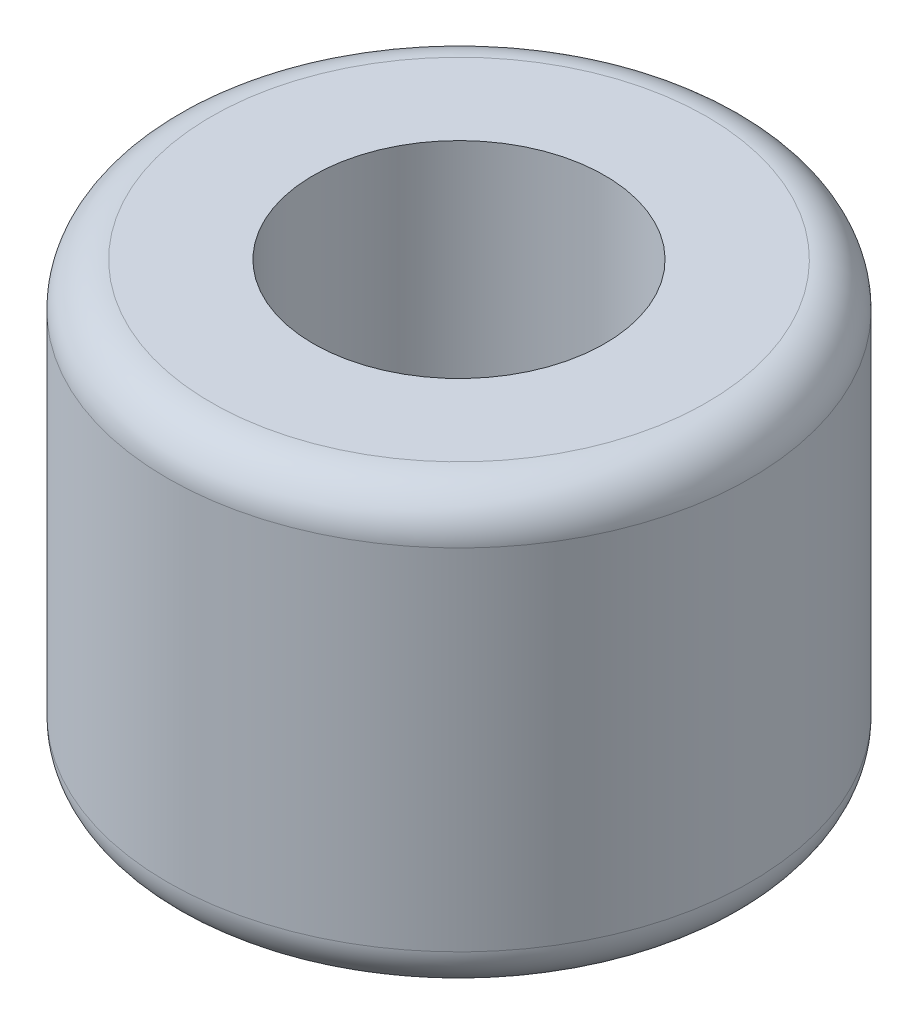
ISO-10303-21;
HEADER;
FILE_DESCRIPTION(('STEP AP214'),'2;1');
FILE_NAME('part.step','',(''),(''),'','','');
FILE_SCHEMA(('AUTOMOTIVE_DESIGN { 1 0 10303 214 1 1 1 1 }'));
ENDSEC;
DATA;
#1=APPLICATION_CONTEXT('core data for automotive mechanical design processes');
#2=APPLICATION_PROTOCOL_DEFINITION('international standard','automotive_design',2000,#1);
#3=PRODUCT_CONTEXT('',#1,'mechanical');
#4=PRODUCT('Part','Part','',(#3));
#5=PRODUCT_RELATED_PRODUCT_CATEGORY('part','',(#4));
#6=PRODUCT_DEFINITION_FORMATION('','',#4);
#7=PRODUCT_DEFINITION_CONTEXT('part definition',#1,'design');
#8=PRODUCT_DEFINITION('design','',#6,#7);
#9=PRODUCT_DEFINITION_SHAPE('','',#8);
#10=(LENGTH_UNIT() NAMED_UNIT(*) SI_UNIT(.MILLI.,.METRE.));
#11=(NAMED_UNIT(*) PLANE_ANGLE_UNIT() SI_UNIT($,.RADIAN.));
#12=(NAMED_UNIT(*) SI_UNIT($,.STERADIAN.) SOLID_ANGLE_UNIT());
#13=UNCERTAINTY_MEASURE_WITH_UNIT(LENGTH_MEASURE(1.E-05),#10,'distance_accuracy_value','');
#14=(GEOMETRIC_REPRESENTATION_CONTEXT(3) GLOBAL_UNCERTAINTY_ASSIGNED_CONTEXT((#13)) GLOBAL_UNIT_ASSIGNED_CONTEXT((#10,
#11,#12)) REPRESENTATION_CONTEXT('',''));
#15=CARTESIAN_POINT('',(0.,0.,0.));
#16=DIRECTION('',(0.,0.,1.));
#17=DIRECTION('',(1.,0.,0.));
#18=AXIS2_PLACEMENT_3D('',#15,#16,#17);
#19=CARTESIAN_POINT('',(101.6,0.,0.));
#20=DIRECTION('',(0.,1.,0.));
#21=DIRECTION('',(0.,0.,1.));
#22=AXIS2_PLACEMENT_3D('',#19,#20,#21);
#23=PLANE('',#22);
#24=CARTESIAN_POINT('',(76.2,0.,0.));
#25=DIRECTION('',(0.,1.,0.));
#26=DIRECTION('',(0.,0.,1.));
#27=AXIS2_PLACEMENT_3D('',#24,#25,#26);
#28=CIRCLE('',#27,12.7);
#29=CARTESIAN_POINT('',(85.979,0.,-8.10315734760227));
#30=VERTEX_POINT('',#29);
#31=CARTESIAN_POINT('',(85.979,0.,8.10315734760227));
#32=VERTEX_POINT('',#31);
#33=EDGE_CURVE('E64',#30,#32,#28,.T.);
#34=ORIENTED_EDGE('',*,*,#33,.T.);
#35=CARTESIAN_POINT('',(0.,0.,0.));
#36=DIRECTION('',(0.,1.,0.));
#37=DIRECTION('',(0.,0.,1.));
#38=AXIS2_PLACEMENT_3D('',#35,#36,#37);
#39=CIRCLE('',#38,86.36);
#40=CARTESIAN_POINT('',(-85.979,0.,8.10315734760227));
#41=VERTEX_POINT('',#40);
#42=EDGE_CURVE('E66',#32,#41,#39,.F.);
#43=ORIENTED_EDGE('',*,*,#42,.T.);
#44=CARTESIAN_POINT('',(-76.2,0.,0.));
#45=DIRECTION('',(0.,1.,0.));
#46=DIRECTION('',(0.,0.,1.));
#47=AXIS2_PLACEMENT_3D('',#44,#45,#46);
#48=CIRCLE('',#47,12.7);
#49=CARTESIAN_POINT('',(-85.979,0.,-8.10315734760227));
#50=VERTEX_POINT('',#49);
#51=EDGE_CURVE('E199',#41,#50,#48,.T.);
#52=ORIENTED_EDGE('',*,*,#51,.T.);
#53=CARTESIAN_POINT('',(0.,0.,0.));
#54=DIRECTION('',(0.,1.,0.));
#55=DIRECTION('',(0.,0.,1.));
#56=AXIS2_PLACEMENT_3D('',#53,#54,#55);
#57=CIRCLE('',#56,86.36);
#58=EDGE_CURVE('E67',#50,#30,#57,.F.);
#59=ORIENTED_EDGE('',*,*,#58,.T.);
#60=EDGE_LOOP('',(#34,#43,#52,#59));
#61=FACE_BOUND('',#60,.T.);
#62=ADVANCED_FACE('F33',(#61),#23,.F.);
#63=CARTESIAN_POINT('',(0.,25.4,0.));
#64=DIRECTION('',(0.,-1.,0.));
#65=DIRECTION('',(0.,0.,-1.));
#66=AXIS2_PLACEMENT_3D('',#63,#64,#65);
#67=PLANE('',#66);
#68=CARTESIAN_POINT('',(0.,25.4,0.));
#69=DIRECTION('',(0.,1.,0.));
#70=DIRECTION('',(0.,0.,1.));
#71=AXIS2_PLACEMENT_3D('',#68,#69,#70);
#72=CIRCLE('',#71,50.8);
#73=CARTESIAN_POINT('',(0.,25.4,50.8));
#74=VERTEX_POINT('',#73);
#75=EDGE_CURVE('E198',#74,#74,#72,.T.);
#76=ORIENTED_EDGE('',*,*,#75,.T.);
#77=EDGE_LOOP('',(#76));
#78=FACE_BOUND('',#77,.T.);
#79=ADVANCED_FACE('F106',(#78),#67,.F.);
#80=CARTESIAN_POINT('',(0.,0.,0.));
#81=DIRECTION('',(0.,1.,0.));
#82=DIRECTION('',(0.,0.,1.));
#83=AXIS2_PLACEMENT_3D('',#80,#81,#82);
#84=CYLINDRICAL_SURFACE('',#83,50.8);
#85=ORIENTED_EDGE('',*,*,#75,.F.);
#86=EDGE_LOOP('',(#85));
#87=FACE_BOUND('',#86,.T.);
#88=CARTESIAN_POINT('',(0.,152.4,0.));
#89=DIRECTION('',(0.,1.,0.));
#90=DIRECTION('',(0.,0.,1.));
#91=AXIS2_PLACEMENT_3D('',#88,#89,#90);
#92=CIRCLE('',#91,50.8);
#93=CARTESIAN_POINT('',(0.,152.4,50.8));
#94=VERTEX_POINT('',#93);
#95=EDGE_CURVE('E196',#94,#94,#92,.T.);
#96=ORIENTED_EDGE('',*,*,#95,.T.);
#97=EDGE_LOOP('',(#96));
#98=FACE_BOUND('',#97,.T.);
#99=ADVANCED_FACE('F102',(#87,#98),#84,.F.);
#100=CARTESIAN_POINT('',(50.8,152.4,0.));
#101=DIRECTION('',(0.,-1.,0.));
#102=DIRECTION('',(0.,0.,-1.));
#103=AXIS2_PLACEMENT_3D('',#100,#101,#102);
#104=PLANE('',#103);
#105=CARTESIAN_POINT('',(0.,152.4,0.));
#106=DIRECTION('',(0.,-1.,0.));
#107=DIRECTION('',(0.,0.,-1.));
#108=AXIS2_PLACEMENT_3D('',#105,#106,#107);
#109=CIRCLE('',#108,86.36);
#110=CARTESIAN_POINT('',(0.,152.4,-86.36));
#111=VERTEX_POINT('',#110);
#112=EDGE_CURVE('E11',#111,#111,#109,.F.);
#113=ORIENTED_EDGE('',*,*,#112,.T.);
#114=EDGE_LOOP('',(#113));
#115=FACE_BOUND('',#114,.T.);
#116=ORIENTED_EDGE('',*,*,#95,.F.);
#117=EDGE_LOOP('',(#116));
#118=FACE_BOUND('',#117,.T.);
#119=ADVANCED_FACE('F98',(#115,#118),#104,.F.);
#120=CARTESIAN_POINT('',(0.,0.,0.));
#121=DIRECTION('',(0.,1.,0.));
#122=DIRECTION('',(0.,0.,1.));
#123=AXIS2_PLACEMENT_3D('',#120,#121,#122);
#124=CYLINDRICAL_SURFACE('',#123,101.6);
#125=CARTESIAN_POINT('',(0.,15.24,0.));
#126=DIRECTION('',(0.,1.,0.));
#127=DIRECTION('',(0.,0.,1.));
#128=AXIS2_PLACEMENT_3D('',#125,#126,#127);
#129=CIRCLE('',#128,101.6);
#130=CARTESIAN_POINT('',(0.,15.24,101.6));
#131=VERTEX_POINT('',#130);
#132=EDGE_CURVE('E75',#131,#131,#129,.T.);
#133=ORIENTED_EDGE('',*,*,#132,.T.);
#134=EDGE_LOOP('',(#133));
#135=FACE_BOUND('',#134,.T.);
#136=CARTESIAN_POINT('',(0.,137.16,0.));
#137=DIRECTION('',(0.,-1.,0.));
#138=DIRECTION('',(0.,0.,-1.));
#139=AXIS2_PLACEMENT_3D('',#136,#137,#138);
#140=CIRCLE('',#139,101.6);
#141=CARTESIAN_POINT('',(0.,137.16,-101.6));
#142=VERTEX_POINT('',#141);
#143=EDGE_CURVE('E191',#142,#142,#140,.T.);
#144=ORIENTED_EDGE('',*,*,#143,.T.);
#145=EDGE_LOOP('',(#144));
#146=FACE_BOUND('',#145,.T.);
#147=ADVANCED_FACE('F94',(#135,#146),#124,.T.);
#148=CARTESIAN_POINT('',(-76.2,63.5,0.));
#149=DIRECTION('',(0.,-1.,0.));
#150=DIRECTION('',(0.,0.,-1.));
#151=AXIS2_PLACEMENT_3D('',#148,#149,#150);
#152=CYLINDRICAL_SURFACE('',#151,12.7);
#153=CARTESIAN_POINT('',(-76.2,63.5,0.));
#154=DIRECTION('',(0.,-1.,0.));
#155=DIRECTION('',(0.,0.,-1.));
#156=AXIS2_PLACEMENT_3D('',#153,#154,#155);
#157=CIRCLE('',#156,12.7);
#158=CARTESIAN_POINT('',(-76.2,63.5,-12.7));
#159=VERTEX_POINT('',#158);
#160=EDGE_CURVE('E68',#159,#159,#157,.T.);
#161=ORIENTED_EDGE('',*,*,#160,.F.);
#162=EDGE_LOOP('',(#161));
#163=FACE_BOUND('',#162,.T.);
#164=ORIENTED_EDGE('',*,*,#51,.F.);
#165=CARTESIAN_POINT('',(-85.979,0.,8.10315734760227));
#166=CARTESIAN_POINT('',(-86.2064080344139,3.53228284826473E-05,7.82877923337576));
#167=CARTESIAN_POINT('',(-86.4221760645276,0.00396392415393852,7.54482039768916));
#168=CARTESIAN_POINT('',(-86.8290196342907,0.017261896777991,6.95992496499968));
#169=CARTESIAN_POINT('',(-87.0200998757241,0.0266302302080088,6.65899161651892));
#170=CARTESIAN_POINT('',(-87.3761905622153,0.0484604563267252,6.04231567580565));
#171=CARTESIAN_POINT('',(-87.5412086940009,0.0609214340759018,5.72657748585997));
#172=CARTESIAN_POINT('',(-87.8441404093158,0.0868888554278346,5.0823876171319));
#173=CARTESIAN_POINT('',(-87.9820532514321,0.100395327613994,4.75393559088109));
#174=CARTESIAN_POINT('',(-88.2298404777689,0.126667517713358,4.08652350550148));
#175=CARTESIAN_POINT('',(-88.339709847833,0.139433102841579,3.74756157934229));
#176=CARTESIAN_POINT('',(-88.5306028900728,0.162750519575065,3.06153487386942));
#177=CARTESIAN_POINT('',(-88.6116267391348,0.173302364755254,2.71447014425764));
#178=CARTESIAN_POINT('',(-88.744200077716,0.191070374419406,2.0148752576846));
#179=CARTESIAN_POINT('',(-88.7957664281737,0.198288446640598,1.66234834611178));
#180=CARTESIAN_POINT('',(-88.8691090604624,0.208672103764167,0.954150563454994));
#181=CARTESIAN_POINT('',(-88.8908856040092,0.211837724268993,0.598479720019391));
#182=CARTESIAN_POINT('',(-88.9044683597616,0.213804107029748,-0.112683842908259));
#183=CARTESIAN_POINT('',(-88.8963386280013,0.21261419838903,-0.468175313889037));
#184=CARTESIAN_POINT('',(-88.8503134924184,0.206006057718569,-1.17718977825992));
#185=CARTESIAN_POINT('',(-88.8124177129835,0.200587772331712,-1.53071274675315));
#186=CARTESIAN_POINT('',(-88.7070975590068,0.186050881982603,-2.2335870039051));
#187=CARTESIAN_POINT('',(-88.6396459077609,0.17692885946479,-2.58293413206673));
#188=CARTESIAN_POINT('',(-88.4757087234525,0.155921459272625,-3.27464603840244));
#189=CARTESIAN_POINT('',(-88.3792243248697,0.144036189578664,-3.61701108884915));
#190=CARTESIAN_POINT('',(-88.1580346946474,0.118821657070781,-4.29201711748457));
#191=CARTESIAN_POINT('',(-88.0333611050163,0.105494021972268,-4.62466852996775));
#192=CARTESIAN_POINT('',(-87.7565643401677,0.0790121268801335,-5.27843137202579));
#193=CARTESIAN_POINT('',(-87.6044362998543,0.0658578980591954,-5.59954074416732));
#194=CARTESIAN_POINT('',(-87.2741740422258,0.0416759807061349,-6.22721187991893));
#195=CARTESIAN_POINT('',(-87.0961006772233,0.0306434526668085,-6.53380551853572));
#196=CARTESIAN_POINT('',(-86.7149611257509,0.0128322885911748,-7.13098253758662));
#197=CARTESIAN_POINT('',(-86.5119120256532,0.00605076351266157,-7.42157666873459));
#198=CARTESIAN_POINT('',(-86.2454449931648,0.00174102482737826,-7.77086299786997));
#199=CARTESIAN_POINT('',(-86.1930711629024,0.00109657364145301,-7.83809918036604));
#200=CARTESIAN_POINT('',(-86.0870188945477,0.000226213699578402,-7.97145550412643));
#201=CARTESIAN_POINT('',(-86.0333414590502,-6.99387940293603E-09,-8.03757644069396));
#202=CARTESIAN_POINT('',(-85.979,0.,-8.10315734760228));
#203=B_SPLINE_CURVE_WITH_KNOTS('',3,(#165,#166,#167,#168,#169,#170,#171,#172,#173,#174,#175,
#176,#177,#178,#179,#180,#181,#182,#183,#184,#185,#186,#187,#188,#189,#190,#191,#192,#193,#194,
#195,#196,#197,#198,#199,#200,#201,#202),.UNSPECIFIED.,.F.,.F.,(4,2,2,2,2,2,2,2,2,2,2,2,2,2,2,2,
2,2,4),(0.,1.06869477671921,2.13718571978978,3.20536093250404,4.27356535902594,5.34196064629181,
6.41034938183538,7.47812597670891,8.54589319066311,9.61137469471175,10.6768696440943,
11.7433500019055,12.8097886914879,13.8750362082325,14.9404726790128,16.0034493369325,
17.0657027953037,17.3213819626156,17.5768703543866),.UNSPECIFIED.);
#204=EDGE_CURVE('E48',#41,#50,#203,.T.);
#205=ORIENTED_EDGE('',*,*,#204,.T.);
#206=EDGE_LOOP('',(#164,#205));
#207=FACE_BOUND('',#206,.T.);
#208=ADVANCED_FACE('F88',(#163,#207),#152,.F.);
#209=CARTESIAN_POINT('',(-76.2,63.5,0.));
#210=DIRECTION('',(0.,-1.,0.));
#211=DIRECTION('',(0.,0.,-1.));
#212=AXIS2_PLACEMENT_3D('',#209,#210,#211);
#213=PLANE('',#212);
#214=ORIENTED_EDGE('',*,*,#160,.T.);
#215=EDGE_LOOP('',(#214));
#216=FACE_BOUND('',#215,.T.);
#217=ADVANCED_FACE('F93',(#216),#213,.T.);
#218=CARTESIAN_POINT('',(76.2,63.5,0.));
#219=DIRECTION('',(0.,-1.,0.));
#220=DIRECTION('',(0.,0.,-1.));
#221=AXIS2_PLACEMENT_3D('',#218,#219,#220);
#222=CYLINDRICAL_SURFACE('',#221,12.7);
#223=CARTESIAN_POINT('',(76.2,63.5,0.));
#224=DIRECTION('',(0.,-1.,0.));
#225=DIRECTION('',(0.,0.,1.));
#226=AXIS2_PLACEMENT_3D('',#223,#224,#225);
#227=CIRCLE('',#226,12.7);
#228=CARTESIAN_POINT('',(76.2,63.5,12.7));
#229=VERTEX_POINT('',#228);
#230=EDGE_CURVE('E69',#229,#229,#227,.T.);
#231=ORIENTED_EDGE('',*,*,#230,.F.);
#232=EDGE_LOOP('',(#231));
#233=FACE_BOUND('',#232,.T.);
#234=ORIENTED_EDGE('',*,*,#33,.F.);
#235=CARTESIAN_POINT('',(85.979,0.,-8.10315734760227));
#236=CARTESIAN_POINT('',(86.2064080344139,3.53228284826473E-05,-7.82877923337576));
#237=CARTESIAN_POINT('',(86.4221760645276,0.00396392415393852,-7.54482039768916));
#238=CARTESIAN_POINT('',(86.8290196342907,0.017261896777991,-6.95992496499968));
#239=CARTESIAN_POINT('',(87.0200998757241,0.0266302302080088,-6.65899161651892));
#240=CARTESIAN_POINT('',(87.3761905622153,0.0484604563267252,-6.04231567580565));
#241=CARTESIAN_POINT('',(87.5412086940009,0.0609214340759018,-5.72657748585997));
#242=CARTESIAN_POINT('',(87.8441404093158,0.0868888554278346,-5.0823876171319));
#243=CARTESIAN_POINT('',(87.9820532514321,0.100395327613994,-4.75393559088109));
#244=CARTESIAN_POINT('',(88.2298404777689,0.126667517713358,-4.08652350550148));
#245=CARTESIAN_POINT('',(88.339709847833,0.139433102841579,-3.74756157934229));
#246=CARTESIAN_POINT('',(88.5306028900728,0.162750519575065,-3.06153487386942));
#247=CARTESIAN_POINT('',(88.6116267391348,0.173302364755254,-2.71447014425764));
#248=CARTESIAN_POINT('',(88.744200077716,0.191070374419406,-2.0148752576846));
#249=CARTESIAN_POINT('',(88.7957664281737,0.198288446640598,-1.66234834611178));
#250=CARTESIAN_POINT('',(88.8691090604624,0.208672103764167,-0.954150563454994));
#251=CARTESIAN_POINT('',(88.8908856040092,0.211837724268993,-0.598479720019391));
#252=CARTESIAN_POINT('',(88.9044683597616,0.213804107029748,0.112683842908259));
#253=CARTESIAN_POINT('',(88.8963386280013,0.21261419838903,0.468175313889037));
#254=CARTESIAN_POINT('',(88.8503134924184,0.206006057718569,1.17718977825992));
#255=CARTESIAN_POINT('',(88.8124177129835,0.200587772331712,1.53071274675315));
#256=CARTESIAN_POINT('',(88.7070975590068,0.186050881982603,2.2335870039051));
#257=CARTESIAN_POINT('',(88.6396459077609,0.17692885946479,2.58293413206673));
#258=CARTESIAN_POINT('',(88.4757087234525,0.155921459272625,3.27464603840244));
#259=CARTESIAN_POINT('',(88.3792243248697,0.144036189578664,3.61701108884915));
#260=CARTESIAN_POINT('',(88.1580346946474,0.118821657070781,4.29201711748457));
#261=CARTESIAN_POINT('',(88.0333611050163,0.105494021972268,4.62466852996775));
#262=CARTESIAN_POINT('',(87.7565643401677,0.0790121268801335,5.27843137202579));
#263=CARTESIAN_POINT('',(87.6044362998543,0.0658578980591954,5.59954074416732));
#264=CARTESIAN_POINT('',(87.2741740422258,0.0416759807061349,6.22721187991893));
#265=CARTESIAN_POINT('',(87.0961006772233,0.0306434526668085,6.53380551853572));
#266=CARTESIAN_POINT('',(86.7149611257509,0.0128322885911748,7.13098253758662));
#267=CARTESIAN_POINT('',(86.5119120256532,0.00605076351266157,7.42157666873459));
#268=CARTESIAN_POINT('',(86.2454449931648,0.00174102482737826,7.77086299786997));
#269=CARTESIAN_POINT('',(86.1930711629024,0.00109657364145301,7.83809918036604));
#270=CARTESIAN_POINT('',(86.0870188945477,0.000226213699578402,7.97145550412643));
#271=CARTESIAN_POINT('',(86.0333414590502,-6.99387940293603E-09,8.03757644069396));
#272=CARTESIAN_POINT('',(85.979,0.,8.10315734760228));
#273=B_SPLINE_CURVE_WITH_KNOTS('',3,(#235,#236,#237,#238,#239,#240,#241,#242,#243,#244,#245,
#246,#247,#248,#249,#250,#251,#252,#253,#254,#255,#256,#257,#258,#259,#260,#261,#262,#263,#264,
#265,#266,#267,#268,#269,#270,#271,#272),.UNSPECIFIED.,.F.,.F.,(4,2,2,2,2,2,2,2,2,2,2,2,2,2,2,2,
2,2,4),(0.,1.06869477671921,2.13718571978978,3.20536093250404,4.27356535902594,5.34196064629181,
6.41034938183538,7.47812597670891,8.54589319066311,9.61137469471175,10.6768696440943,
11.7433500019055,12.8097886914879,13.8750362082325,14.9404726790128,16.0034493369325,
17.0657027953037,17.3213819626156,17.5768703543866),.UNSPECIFIED.);
#274=EDGE_CURVE('E41',#30,#32,#273,.T.);
#275=ORIENTED_EDGE('',*,*,#274,.T.);
#276=EDGE_LOOP('',(#234,#275));
#277=FACE_BOUND('',#276,.T.);
#278=ADVANCED_FACE('F63',(#233,#277),#222,.F.);
#279=CARTESIAN_POINT('',(76.2,63.5,0.));
#280=DIRECTION('',(0.,1.,0.));
#281=DIRECTION('',(0.,0.,1.));
#282=AXIS2_PLACEMENT_3D('',#279,#280,#281);
#283=PLANE('',#282);
#284=ORIENTED_EDGE('',*,*,#230,.T.);
#285=EDGE_LOOP('',(#284));
#286=FACE_BOUND('',#285,.T.);
#287=ADVANCED_FACE('F146',(#286),#283,.F.);
#288=CARTESIAN_POINT('',(0.,15.24,0.));
#289=DIRECTION('',(0.,1.,0.));
#290=DIRECTION('',(0.,0.,1.));
#291=AXIS2_PLACEMENT_3D('',#288,#289,#290);
#292=TOROIDAL_SURFACE('',#291,86.36,15.24);
#293=ORIENTED_EDGE('',*,*,#204,.F.);
#294=ORIENTED_EDGE('',*,*,#42,.F.);
#295=ORIENTED_EDGE('',*,*,#274,.F.);
#296=ORIENTED_EDGE('',*,*,#58,.F.);
#297=EDGE_LOOP('',(#293,#294,#295,#296));
#298=FACE_BOUND('',#297,.T.);
#299=ORIENTED_EDGE('',*,*,#132,.F.);
#300=EDGE_LOOP('',(#299));
#301=FACE_BOUND('',#300,.T.);
#302=ADVANCED_FACE('F71',(#298,#301),#292,.T.);
#303=CARTESIAN_POINT('',(0.,137.16,0.));
#304=DIRECTION('',(0.,-1.,0.));
#305=DIRECTION('',(0.,0.,-1.));
#306=AXIS2_PLACEMENT_3D('',#303,#304,#305);
#307=TOROIDAL_SURFACE('',#306,86.36,15.24);
#308=ORIENTED_EDGE('',*,*,#143,.F.);
#309=EDGE_LOOP('',(#308));
#310=FACE_BOUND('',#309,.T.);
#311=ORIENTED_EDGE('',*,*,#112,.F.);
#312=EDGE_LOOP('',(#311));
#313=FACE_BOUND('',#312,.T.);
#314=ADVANCED_FACE('F35',(#310,#313),#307,.T.);
#315=CLOSED_SHELL('',(#62,#79,#99,#119,#147,#208,#217,#278,#287,#302,#314));
#316=MANIFOLD_SOLID_BREP('B2',#315);
#317=ADVANCED_BREP_SHAPE_REPRESENTATION('',(#18,#316),#14);
#318=SHAPE_DEFINITION_REPRESENTATION(#9,#317);
ENDSEC;
END-ISO-10303-21;
